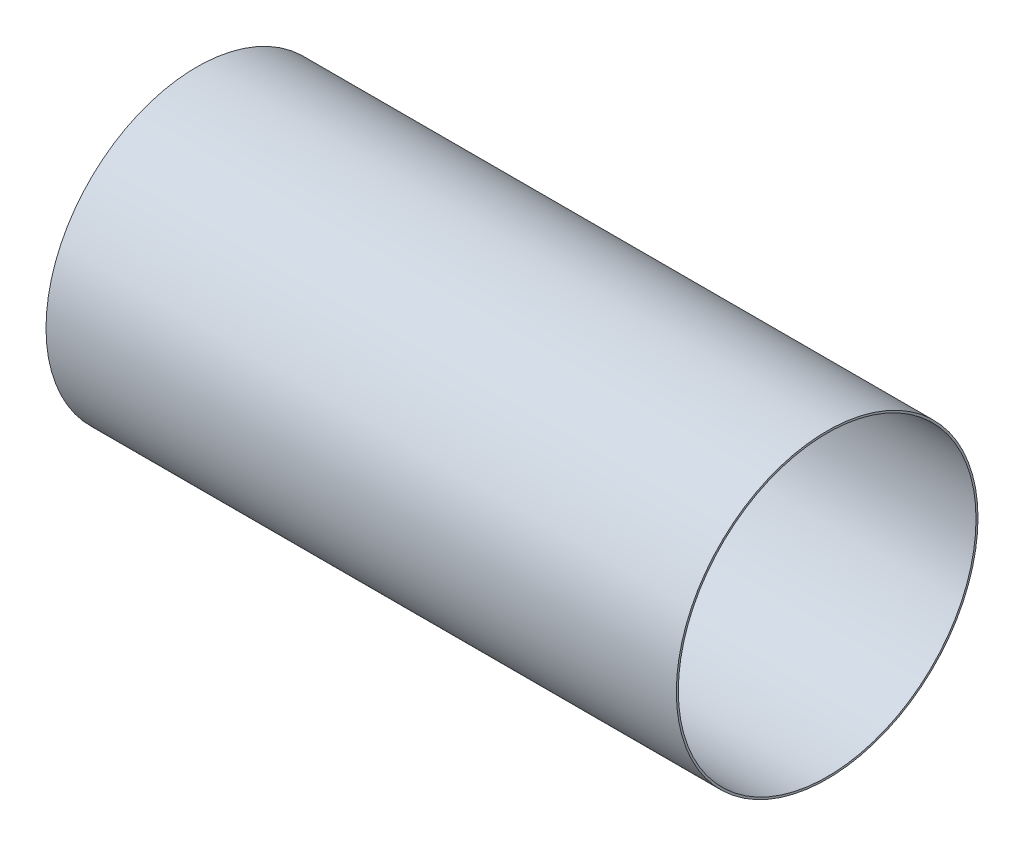
ISO-10303-21;
HEADER;
FILE_DESCRIPTION(('STEP AP214'),'2;1');
FILE_NAME('part.step','',(''),(''),'','','');
FILE_SCHEMA(('AUTOMOTIVE_DESIGN { 1 0 10303 214 1 1 1 1 }'));
ENDSEC;
DATA;
#1=APPLICATION_CONTEXT('core data for automotive mechanical design processes');
#2=APPLICATION_PROTOCOL_DEFINITION('international standard','automotive_design',2000,#1);
#3=PRODUCT_CONTEXT('',#1,'mechanical');
#4=PRODUCT('Part','Part','',(#3));
#5=PRODUCT_RELATED_PRODUCT_CATEGORY('part','',(#4));
#6=PRODUCT_DEFINITION_FORMATION('','',#4);
#7=PRODUCT_DEFINITION_CONTEXT('part definition',#1,'design');
#8=PRODUCT_DEFINITION('design','',#6,#7);
#9=PRODUCT_DEFINITION_SHAPE('','',#8);
#10=(LENGTH_UNIT() NAMED_UNIT(*) SI_UNIT(.MILLI.,.METRE.));
#11=(NAMED_UNIT(*) PLANE_ANGLE_UNIT() SI_UNIT($,.RADIAN.));
#12=(NAMED_UNIT(*) SI_UNIT($,.STERADIAN.) SOLID_ANGLE_UNIT());
#13=UNCERTAINTY_MEASURE_WITH_UNIT(LENGTH_MEASURE(1.E-05),#10,'distance_accuracy_value','');
#14=(GEOMETRIC_REPRESENTATION_CONTEXT(3) GLOBAL_UNCERTAINTY_ASSIGNED_CONTEXT((#13)) GLOBAL_UNIT_ASSIGNED_CONTEXT((#10,
#11,#12)) REPRESENTATION_CONTEXT('',''));
#15=CARTESIAN_POINT('',(0.,0.,0.));
#16=DIRECTION('',(0.,0.,1.));
#17=DIRECTION('',(1.,0.,0.));
#18=AXIS2_PLACEMENT_3D('',#15,#16,#17);
#19=CARTESIAN_POINT('',(317.6,0.,0.));
#20=DIRECTION('',(1.,0.,0.));
#21=DIRECTION('',(0.,0.,-1.));
#22=AXIS2_PLACEMENT_3D('',#19,#20,#21);
#23=PLANE('',#22);
#24=CARTESIAN_POINT('',(317.6,0.,0.));
#25=DIRECTION('',(1.,0.,0.));
#26=DIRECTION('',(0.,0.,-1.));
#27=AXIS2_PLACEMENT_3D('',#24,#25,#26);
#28=CIRCLE('',#27,76.);
#29=CARTESIAN_POINT('',(317.6,0.,-76.));
#30=VERTEX_POINT('',#29);
#31=EDGE_CURVE('E10',#30,#30,#28,.T.);
#32=ORIENTED_EDGE('',*,*,#31,.T.);
#33=EDGE_LOOP('',(#32));
#34=FACE_BOUND('',#33,.T.);
#35=CARTESIAN_POINT('',(317.6,0.,0.));
#36=DIRECTION('',(1.,0.,0.));
#37=DIRECTION('',(0.,0.,-1.));
#38=AXIS2_PLACEMENT_3D('',#35,#36,#37);
#39=CIRCLE('',#38,75.);
#40=CARTESIAN_POINT('',(317.6,0.,-75.));
#41=VERTEX_POINT('',#40);
#42=EDGE_CURVE('E42',#41,#41,#39,.T.);
#43=ORIENTED_EDGE('',*,*,#42,.F.);
#44=EDGE_LOOP('',(#43));
#45=FACE_BOUND('',#44,.T.);
#46=ADVANCED_FACE('F31',(#34,#45),#23,.T.);
#47=CARTESIAN_POINT('',(0.,0.,0.));
#48=DIRECTION('',(1.,0.,0.));
#49=DIRECTION('',(0.,0.,-1.));
#50=AXIS2_PLACEMENT_3D('',#47,#48,#49);
#51=PLANE('',#50);
#52=CARTESIAN_POINT('',(0.,0.,0.));
#53=DIRECTION('',(1.,0.,0.));
#54=DIRECTION('',(0.,0.,-1.));
#55=AXIS2_PLACEMENT_3D('',#52,#53,#54);
#56=CIRCLE('',#55,76.);
#57=CARTESIAN_POINT('',(0.,0.,-76.));
#58=VERTEX_POINT('',#57);
#59=EDGE_CURVE('E35',#58,#58,#56,.T.);
#60=ORIENTED_EDGE('',*,*,#59,.F.);
#61=EDGE_LOOP('',(#60));
#62=FACE_BOUND('',#61,.T.);
#63=CARTESIAN_POINT('',(0.,0.,0.));
#64=DIRECTION('',(1.,0.,0.));
#65=DIRECTION('',(0.,0.,-1.));
#66=AXIS2_PLACEMENT_3D('',#63,#64,#65);
#67=CIRCLE('',#66,75.);
#68=CARTESIAN_POINT('',(0.,0.,-75.));
#69=VERTEX_POINT('',#68);
#70=EDGE_CURVE('E44',#69,#69,#67,.T.);
#71=ORIENTED_EDGE('',*,*,#70,.T.);
#72=EDGE_LOOP('',(#71));
#73=FACE_BOUND('',#72,.T.);
#74=ADVANCED_FACE('F54',(#62,#73),#51,.F.);
#75=CARTESIAN_POINT('',(317.6,0.,0.));
#76=DIRECTION('',(-1.,0.,0.));
#77=DIRECTION('',(0.,0.,1.));
#78=AXIS2_PLACEMENT_3D('',#75,#76,#77);
#79=CYLINDRICAL_SURFACE('',#78,76.);
#80=ORIENTED_EDGE('',*,*,#31,.F.);
#81=EDGE_LOOP('',(#80));
#82=FACE_BOUND('',#81,.T.);
#83=ORIENTED_EDGE('',*,*,#59,.T.);
#84=EDGE_LOOP('',(#83));
#85=FACE_BOUND('',#84,.T.);
#86=ADVANCED_FACE('F33',(#82,#85),#79,.T.);
#87=CARTESIAN_POINT('',(317.6,0.,0.));
#88=DIRECTION('',(-1.,0.,0.));
#89=DIRECTION('',(0.,0.,1.));
#90=AXIS2_PLACEMENT_3D('',#87,#88,#89);
#91=CYLINDRICAL_SURFACE('',#90,75.);
#92=ORIENTED_EDGE('',*,*,#42,.T.);
#93=EDGE_LOOP('',(#92));
#94=FACE_BOUND('',#93,.T.);
#95=ORIENTED_EDGE('',*,*,#70,.F.);
#96=EDGE_LOOP('',(#95));
#97=FACE_BOUND('',#96,.T.);
#98=ADVANCED_FACE('F50',(#94,#97),#91,.F.);
#99=CLOSED_SHELL('',(#46,#74,#86,#98));
#100=MANIFOLD_SOLID_BREP('B2',#99);
#101=ADVANCED_BREP_SHAPE_REPRESENTATION('',(#18,#100),#14);
#102=SHAPE_DEFINITION_REPRESENTATION(#9,#101);
ENDSEC;
END-ISO-10303-21;
